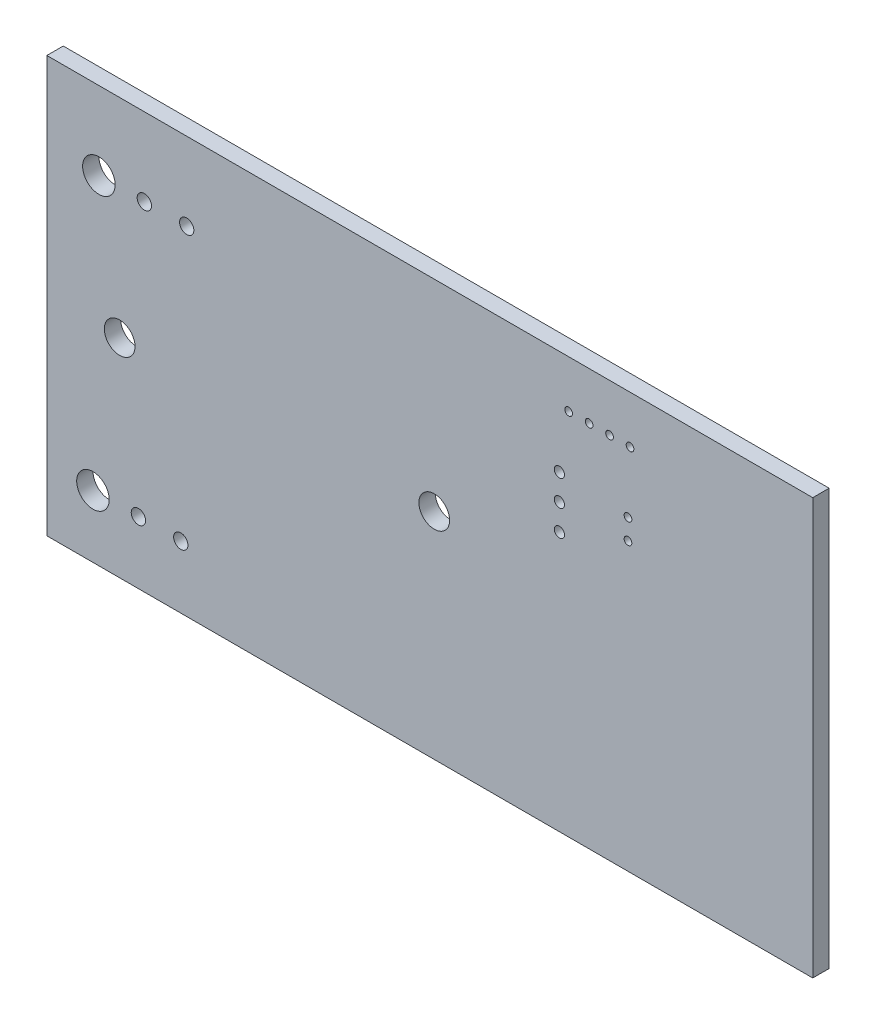
ISO-10303-21;
HEADER;
FILE_DESCRIPTION(('STEP AP214'),'2;1');
FILE_NAME('part.step','',(''),(''),'','','');
FILE_SCHEMA(('AUTOMOTIVE_DESIGN { 1 0 10303 214 1 1 1 1 }'));
ENDSEC;
DATA;
#1=APPLICATION_CONTEXT('core data for automotive mechanical design processes');
#2=APPLICATION_PROTOCOL_DEFINITION('international standard','automotive_design',2000,#1);
#3=PRODUCT_CONTEXT('',#1,'mechanical');
#4=PRODUCT('Part','Part','',(#3));
#5=PRODUCT_RELATED_PRODUCT_CATEGORY('part','',(#4));
#6=PRODUCT_DEFINITION_FORMATION('','',#4);
#7=PRODUCT_DEFINITION_CONTEXT('part definition',#1,'design');
#8=PRODUCT_DEFINITION('design','',#6,#7);
#9=PRODUCT_DEFINITION_SHAPE('','',#8);
#10=(LENGTH_UNIT() NAMED_UNIT(*) SI_UNIT(.MILLI.,.METRE.));
#11=(NAMED_UNIT(*) PLANE_ANGLE_UNIT() SI_UNIT($,.RADIAN.));
#12=(NAMED_UNIT(*) SI_UNIT($,.STERADIAN.) SOLID_ANGLE_UNIT());
#13=UNCERTAINTY_MEASURE_WITH_UNIT(LENGTH_MEASURE(1.E-05),#10,'distance_accuracy_value','');
#14=(GEOMETRIC_REPRESENTATION_CONTEXT(3) GLOBAL_UNCERTAINTY_ASSIGNED_CONTEXT((#13)) GLOBAL_UNIT_ASSIGNED_CONTEXT((#10,
#11,#12)) REPRESENTATION_CONTEXT('',''));
#15=CARTESIAN_POINT('',(0.,0.,0.));
#16=DIRECTION('',(0.,0.,1.));
#17=DIRECTION('',(1.,0.,0.));
#18=AXIS2_PLACEMENT_3D('',#15,#16,#17);
#19=CARTESIAN_POINT('',(144.09,-106.68,1.6));
#20=DIRECTION('',(0.,0.,1.));
#21=DIRECTION('',(1.,0.,0.));
#22=AXIS2_PLACEMENT_3D('',#19,#20,#21);
#23=PLANE('',#22);
#24=CARTESIAN_POINT('',(115.621,-120.904,1.6));
#25=DIRECTION('',(0.,0.,1.));
#26=DIRECTION('',(1.,0.,0.));
#27=AXIS2_PLACEMENT_3D('',#24,#25,#26);
#28=CIRCLE('',#27,0.7);
#29=CARTESIAN_POINT('',(116.321,-120.904,1.6));
#30=VERTEX_POINT('',#29);
#31=EDGE_CURVE('E19',#30,#30,#28,.F.);
#32=ORIENTED_EDGE('',*,*,#31,.T.);
#33=EDGE_LOOP('',(#32));
#34=FACE_BOUND('',#33,.T.);
#35=CARTESIAN_POINT('',(111.181,-120.904,1.6));
#36=DIRECTION('',(0.,0.,1.));
#37=DIRECTION('',(1.,0.,0.));
#38=AXIS2_PLACEMENT_3D('',#35,#36,#37);
#39=CIRCLE('',#38,1.59);
#40=CARTESIAN_POINT('',(112.771,-120.904,1.6));
#41=VERTEX_POINT('',#40);
#42=EDGE_CURVE('E127',#41,#41,#39,.F.);
#43=ORIENTED_EDGE('',*,*,#42,.T.);
#44=EDGE_LOOP('',(#43));
#45=FACE_BOUND('',#44,.T.);
#46=CARTESIAN_POINT('',(113.792,-106.68,1.6));
#47=DIRECTION('',(0.,0.,1.));
#48=DIRECTION('',(1.,0.,0.));
#49=AXIS2_PLACEMENT_3D('',#46,#47,#48);
#50=CIRCLE('',#49,1.5);
#51=CARTESIAN_POINT('',(115.292,-106.68,1.6));
#52=VERTEX_POINT('',#51);
#53=EDGE_CURVE('E166',#52,#52,#50,.F.);
#54=ORIENTED_EDGE('',*,*,#53,.T.);
#55=EDGE_LOOP('',(#54));
#56=FACE_BOUND('',#55,.T.);
#57=CARTESIAN_POINT('',(116.2,-93.98,1.6));
#58=DIRECTION('',(0.,0.,1.));
#59=DIRECTION('',(1.,0.,0.));
#60=AXIS2_PLACEMENT_3D('',#57,#58,#59);
#61=CIRCLE('',#60,0.7);
#62=CARTESIAN_POINT('',(116.9,-93.98,1.6));
#63=VERTEX_POINT('',#62);
#64=EDGE_CURVE('E171',#63,#63,#61,.F.);
#65=ORIENTED_EDGE('',*,*,#64,.T.);
#66=EDGE_LOOP('',(#65));
#67=FACE_BOUND('',#66,.T.);
#68=CARTESIAN_POINT('',(111.76,-93.98,1.6));
#69=DIRECTION('',(0.,0.,1.));
#70=DIRECTION('',(1.,0.,0.));
#71=AXIS2_PLACEMENT_3D('',#68,#69,#70);
#72=CIRCLE('',#71,1.59);
#73=CARTESIAN_POINT('',(113.35,-93.98,1.6));
#74=VERTEX_POINT('',#73);
#75=EDGE_CURVE('E169',#74,#74,#72,.F.);
#76=ORIENTED_EDGE('',*,*,#75,.T.);
#77=EDGE_LOOP('',(#76));
#78=FACE_BOUND('',#77,.T.);
#79=CARTESIAN_POINT('',(120.34,-93.98,1.6));
#80=DIRECTION('',(0.,0.,1.));
#81=DIRECTION('',(1.,0.,0.));
#82=AXIS2_PLACEMENT_3D('',#79,#80,#81);
#83=CIRCLE('',#82,0.7);
#84=CARTESIAN_POINT('',(121.04,-93.98,1.6));
#85=VERTEX_POINT('',#84);
#86=EDGE_CURVE('E163',#85,#85,#83,.F.);
#87=ORIENTED_EDGE('',*,*,#86,.T.);
#88=EDGE_LOOP('',(#87));
#89=FACE_BOUND('',#88,.T.);
#90=CARTESIAN_POINT('',(119.761,-120.904,1.6));
#91=DIRECTION('',(0.,0.,1.));
#92=DIRECTION('',(1.,0.,0.));
#93=AXIS2_PLACEMENT_3D('',#90,#91,#92);
#94=CIRCLE('',#93,0.7);
#95=CARTESIAN_POINT('',(120.461,-120.904,1.6));
#96=VERTEX_POINT('',#95);
#97=EDGE_CURVE('E160',#96,#96,#94,.F.);
#98=ORIENTED_EDGE('',*,*,#97,.T.);
#99=EDGE_LOOP('',(#98));
#100=FACE_BOUND('',#99,.T.);
#101=CARTESIAN_POINT('',(144.526,-106.0196,1.6));
#102=DIRECTION('',(0.,0.,1.));
#103=DIRECTION('',(1.,0.,0.));
#104=AXIS2_PLACEMENT_3D('',#101,#102,#103);
#105=CIRCLE('',#104,1.5);
#106=CARTESIAN_POINT('',(146.026,-106.0196,1.6));
#107=VERTEX_POINT('',#106);
#108=EDGE_CURVE('E145',#107,#107,#105,.F.);
#109=ORIENTED_EDGE('',*,*,#108,.T.);
#110=EDGE_LOOP('',(#109));
#111=FACE_BOUND('',#110,.T.);
#112=CARTESIAN_POINT('',(156.75,-101.65,1.6));
#113=DIRECTION('',(0.,0.,1.));
#114=DIRECTION('',(1.,0.,0.));
#115=AXIS2_PLACEMENT_3D('',#112,#113,#114);
#116=CIRCLE('',#115,0.5);
#117=CARTESIAN_POINT('',(157.25,-101.65,1.6));
#118=VERTEX_POINT('',#117);
#119=EDGE_CURVE('E154',#118,#118,#116,.F.);
#120=ORIENTED_EDGE('',*,*,#119,.T.);
#121=EDGE_LOOP('',(#120));
#122=FACE_BOUND('',#121,.T.);
#123=CARTESIAN_POINT('',(159.65,-91.,1.6));
#124=DIRECTION('',(0.,0.,1.));
#125=DIRECTION('',(1.,0.,0.));
#126=AXIS2_PLACEMENT_3D('',#123,#124,#125);
#127=CIRCLE('',#126,0.375);
#128=CARTESIAN_POINT('',(160.025,-91.,1.6));
#129=VERTEX_POINT('',#128);
#130=EDGE_CURVE('E139',#129,#129,#127,.F.);
#131=ORIENTED_EDGE('',*,*,#130,.T.);
#132=EDGE_LOOP('',(#131));
#133=FACE_BOUND('',#132,.T.);
#134=CARTESIAN_POINT('',(157.65,-91.,1.6));
#135=DIRECTION('',(0.,0.,1.));
#136=DIRECTION('',(1.,0.,0.));
#137=AXIS2_PLACEMENT_3D('',#134,#135,#136);
#138=CIRCLE('',#137,0.375);
#139=CARTESIAN_POINT('',(158.025,-91.,1.6));
#140=VERTEX_POINT('',#139);
#141=EDGE_CURVE('E157',#140,#140,#138,.F.);
#142=ORIENTED_EDGE('',*,*,#141,.T.);
#143=EDGE_LOOP('',(#142));
#144=FACE_BOUND('',#143,.T.);
#145=CARTESIAN_POINT('',(156.75,-96.57,1.6));
#146=DIRECTION('',(0.,0.,1.));
#147=DIRECTION('',(1.,0.,0.));
#148=AXIS2_PLACEMENT_3D('',#145,#146,#147);
#149=CIRCLE('',#148,0.5);
#150=CARTESIAN_POINT('',(157.25,-96.57,1.6));
#151=VERTEX_POINT('',#150);
#152=EDGE_CURVE('E151',#151,#151,#149,.F.);
#153=ORIENTED_EDGE('',*,*,#152,.T.);
#154=EDGE_LOOP('',(#153));
#155=FACE_BOUND('',#154,.T.);
#156=CARTESIAN_POINT('',(156.75,-99.11,1.6));
#157=DIRECTION('',(0.,0.,1.));
#158=DIRECTION('',(1.,0.,0.));
#159=AXIS2_PLACEMENT_3D('',#156,#157,#158);
#160=CIRCLE('',#159,0.5);
#161=CARTESIAN_POINT('',(157.25,-99.11,1.6));
#162=VERTEX_POINT('',#161);
#163=EDGE_CURVE('E148',#162,#162,#160,.F.);
#164=ORIENTED_EDGE('',*,*,#163,.T.);
#165=EDGE_LOOP('',(#164));
#166=FACE_BOUND('',#165,.T.);
#167=CARTESIAN_POINT('',(163.65,-91.,1.6));
#168=DIRECTION('',(0.,0.,1.));
#169=DIRECTION('',(1.,0.,0.));
#170=AXIS2_PLACEMENT_3D('',#167,#168,#169);
#171=CIRCLE('',#170,0.375);
#172=CARTESIAN_POINT('',(164.025,-91.,1.6));
#173=VERTEX_POINT('',#172);
#174=EDGE_CURVE('E133',#173,#173,#171,.F.);
#175=ORIENTED_EDGE('',*,*,#174,.T.);
#176=EDGE_LOOP('',(#175));
#177=FACE_BOUND('',#176,.T.);
#178=CARTESIAN_POINT('',(161.65,-91.,1.6));
#179=DIRECTION('',(0.,0.,1.));
#180=DIRECTION('',(1.,0.,0.));
#181=AXIS2_PLACEMENT_3D('',#178,#179,#180);
#182=CIRCLE('',#181,0.375);
#183=CARTESIAN_POINT('',(162.025,-91.,1.6));
#184=VERTEX_POINT('',#183);
#185=EDGE_CURVE('E136',#184,#184,#182,.F.);
#186=ORIENTED_EDGE('',*,*,#185,.T.);
#187=EDGE_LOOP('',(#186));
#188=FACE_BOUND('',#187,.T.);
#189=CARTESIAN_POINT('',(163.45,-97.05,1.6));
#190=DIRECTION('',(0.,0.,1.));
#191=DIRECTION('',(1.,0.,0.));
#192=AXIS2_PLACEMENT_3D('',#189,#190,#191);
#193=CIRCLE('',#192,0.375);
#194=CARTESIAN_POINT('',(163.825,-97.05,1.6));
#195=VERTEX_POINT('',#194);
#196=EDGE_CURVE('E142',#195,#195,#193,.F.);
#197=ORIENTED_EDGE('',*,*,#196,.T.);
#198=EDGE_LOOP('',(#197));
#199=FACE_BOUND('',#198,.T.);
#200=CARTESIAN_POINT('',(163.45,-99.05,1.6));
#201=DIRECTION('',(0.,0.,1.));
#202=DIRECTION('',(1.,0.,0.));
#203=AXIS2_PLACEMENT_3D('',#200,#201,#202);
#204=CIRCLE('',#203,0.375);
#205=CARTESIAN_POINT('',(163.825,-99.05,1.6));
#206=VERTEX_POINT('',#205);
#207=EDGE_CURVE('E130',#206,#206,#204,.F.);
#208=ORIENTED_EDGE('',*,*,#207,.T.);
#209=EDGE_LOOP('',(#208));
#210=FACE_BOUND('',#209,.T.);
#211=DIRECTION('',(1.,0.,0.));
#212=VECTOR('',#211,1.);
#213=CARTESIAN_POINT('',(181.5,-86.36,1.6));
#214=LINE('',#213,#212);
#215=CARTESIAN_POINT('',(181.5,-86.36,1.6));
#216=VERTEX_POINT('',#215);
#217=CARTESIAN_POINT('',(106.68,-86.36,1.6));
#218=VERTEX_POINT('',#217);
#219=EDGE_CURVE('E185',#216,#218,#214,.F.);
#220=ORIENTED_EDGE('',*,*,#219,.T.);
#221=DIRECTION('',(0.,1.,0.));
#222=VECTOR('',#221,1.);
#223=CARTESIAN_POINT('',(106.68,-86.36,1.6));
#224=LINE('',#223,#222);
#225=CARTESIAN_POINT('',(106.68,-127.,1.6));
#226=VERTEX_POINT('',#225);
#227=EDGE_CURVE('E59',#218,#226,#224,.F.);
#228=ORIENTED_EDGE('',*,*,#227,.T.);
#229=DIRECTION('',(1.,0.,0.));
#230=VECTOR('',#229,1.);
#231=CARTESIAN_POINT('',(106.68,-127.,1.6));
#232=LINE('',#231,#230);
#233=CARTESIAN_POINT('',(181.5,-127.,1.6));
#234=VERTEX_POINT('',#233);
#235=EDGE_CURVE('E58',#226,#234,#232,.T.);
#236=ORIENTED_EDGE('',*,*,#235,.T.);
#237=DIRECTION('',(0.,1.,0.));
#238=VECTOR('',#237,1.);
#239=CARTESIAN_POINT('',(181.5,-127.,1.6));
#240=LINE('',#239,#238);
#241=EDGE_CURVE('E55',#234,#216,#240,.T.);
#242=ORIENTED_EDGE('',*,*,#241,.T.);
#243=EDGE_LOOP('',(#220,#228,#236,#242));
#244=FACE_BOUND('',#243,.T.);
#245=ADVANCED_FACE('F16',(#34,#45,#56,#67,#78,#89,#100,#111,#122,#133,#144,#155,#166,#177,#188,
#199,#210,#244),#23,.T.);
#246=CARTESIAN_POINT('',(106.68,-127.,0.));
#247=DIRECTION('',(0.,1.,0.));
#248=DIRECTION('',(0.,0.,1.));
#249=AXIS2_PLACEMENT_3D('',#246,#247,#248);
#250=PLANE('',#249);
#251=DIRECTION('',(0.,0.,1.));
#252=VECTOR('',#251,1.);
#253=CARTESIAN_POINT('',(181.5,-127.,0.));
#254=LINE('',#253,#252);
#255=CARTESIAN_POINT('',(181.5,-127.,0.));
#256=VERTEX_POINT('',#255);
#257=EDGE_CURVE('E64',#256,#234,#254,.T.);
#258=ORIENTED_EDGE('',*,*,#257,.T.);
#259=ORIENTED_EDGE('',*,*,#235,.F.);
#260=DIRECTION('',(0.,0.,-1.));
#261=VECTOR('',#260,1.);
#262=CARTESIAN_POINT('',(106.68,-127.,0.));
#263=LINE('',#262,#261);
#264=CARTESIAN_POINT('',(106.68,-127.,0.));
#265=VERTEX_POINT('',#264);
#266=EDGE_CURVE('E176',#226,#265,#263,.T.);
#267=ORIENTED_EDGE('',*,*,#266,.T.);
#268=DIRECTION('',(1.,0.,0.));
#269=VECTOR('',#268,1.);
#270=CARTESIAN_POINT('',(144.09,-127.,0.));
#271=LINE('',#270,#269);
#272=EDGE_CURVE('E75',#265,#256,#271,.T.);
#273=ORIENTED_EDGE('',*,*,#272,.T.);
#274=EDGE_LOOP('',(#258,#259,#267,#273));
#275=FACE_BOUND('',#274,.T.);
#276=ADVANCED_FACE('F74',(#275),#250,.F.);
#277=CARTESIAN_POINT('',(181.5,-127.,0.));
#278=DIRECTION('',(-1.,0.,0.));
#279=DIRECTION('',(0.,0.,1.));
#280=AXIS2_PLACEMENT_3D('',#277,#278,#279);
#281=PLANE('',#280);
#282=DIRECTION('',(0.,0.,-1.));
#283=VECTOR('',#282,1.);
#284=CARTESIAN_POINT('',(181.5,-86.36,0.));
#285=LINE('',#284,#283);
#286=CARTESIAN_POINT('',(181.5,-86.36,0.));
#287=VERTEX_POINT('',#286);
#288=EDGE_CURVE('E71',#287,#216,#285,.F.);
#289=ORIENTED_EDGE('',*,*,#288,.T.);
#290=ORIENTED_EDGE('',*,*,#241,.F.);
#291=ORIENTED_EDGE('',*,*,#257,.F.);
#292=DIRECTION('',(0.,1.,0.));
#293=VECTOR('',#292,1.);
#294=CARTESIAN_POINT('',(181.5,-106.68,0.));
#295=LINE('',#294,#293);
#296=EDGE_CURVE('E193',#256,#287,#295,.T.);
#297=ORIENTED_EDGE('',*,*,#296,.T.);
#298=EDGE_LOOP('',(#289,#290,#291,#297));
#299=FACE_BOUND('',#298,.T.);
#300=ADVANCED_FACE('F68',(#299),#281,.F.);
#301=CARTESIAN_POINT('',(181.5,-86.36,0.));
#302=DIRECTION('',(0.,-1.,0.));
#303=DIRECTION('',(0.,0.,-1.));
#304=AXIS2_PLACEMENT_3D('',#301,#302,#303);
#305=PLANE('',#304);
#306=DIRECTION('',(0.,0.,-1.));
#307=VECTOR('',#306,1.);
#308=CARTESIAN_POINT('',(106.68,-86.36,0.));
#309=LINE('',#308,#307);
#310=CARTESIAN_POINT('',(106.68,-86.36,0.));
#311=VERTEX_POINT('',#310);
#312=EDGE_CURVE('E34',#311,#218,#309,.F.);
#313=ORIENTED_EDGE('',*,*,#312,.T.);
#314=ORIENTED_EDGE('',*,*,#219,.F.);
#315=ORIENTED_EDGE('',*,*,#288,.F.);
#316=DIRECTION('',(1.,0.,0.));
#317=VECTOR('',#316,1.);
#318=CARTESIAN_POINT('',(144.09,-86.36,0.));
#319=LINE('',#318,#317);
#320=EDGE_CURVE('E191',#287,#311,#319,.F.);
#321=ORIENTED_EDGE('',*,*,#320,.T.);
#322=EDGE_LOOP('',(#313,#314,#315,#321));
#323=FACE_BOUND('',#322,.T.);
#324=ADVANCED_FACE('F189',(#323),#305,.F.);
#325=CARTESIAN_POINT('',(106.68,-86.36,0.));
#326=DIRECTION('',(1.,0.,0.));
#327=DIRECTION('',(0.,0.,-1.));
#328=AXIS2_PLACEMENT_3D('',#325,#326,#327);
#329=PLANE('',#328);
#330=ORIENTED_EDGE('',*,*,#266,.F.);
#331=ORIENTED_EDGE('',*,*,#227,.F.);
#332=ORIENTED_EDGE('',*,*,#312,.F.);
#333=DIRECTION('',(0.,1.,0.));
#334=VECTOR('',#333,1.);
#335=CARTESIAN_POINT('',(106.68,-106.68,0.));
#336=LINE('',#335,#334);
#337=EDGE_CURVE('E126',#311,#265,#336,.F.);
#338=ORIENTED_EDGE('',*,*,#337,.T.);
#339=EDGE_LOOP('',(#330,#331,#332,#338));
#340=FACE_BOUND('',#339,.T.);
#341=ADVANCED_FACE('F187',(#340),#329,.F.);
#342=CARTESIAN_POINT('',(115.621,-120.904,-0.8));
#343=DIRECTION('',(0.,0.,1.));
#344=DIRECTION('',(1.,0.,0.));
#345=AXIS2_PLACEMENT_3D('',#342,#343,#344);
#346=CYLINDRICAL_SURFACE('',#345,0.7);
#347=CARTESIAN_POINT('',(115.621,-120.904,0.));
#348=DIRECTION('',(0.,0.,1.));
#349=DIRECTION('',(1.,0.,0.));
#350=AXIS2_PLACEMENT_3D('',#347,#348,#349);
#351=CIRCLE('',#350,0.7);
#352=CARTESIAN_POINT('',(116.321,-120.904,0.));
#353=VERTEX_POINT('',#352);
#354=EDGE_CURVE('E123',#353,#353,#351,.F.);
#355=ORIENTED_EDGE('',*,*,#354,.T.);
#356=EDGE_LOOP('',(#355));
#357=FACE_BOUND('',#356,.T.);
#358=ORIENTED_EDGE('',*,*,#31,.F.);
#359=EDGE_LOOP('',(#358));
#360=FACE_BOUND('',#359,.T.);
#361=ADVANCED_FACE('F269',(#357,#360),#346,.F.);
#362=CARTESIAN_POINT('',(116.2,-93.98,-0.8));
#363=DIRECTION('',(0.,0.,1.));
#364=DIRECTION('',(1.,0.,0.));
#365=AXIS2_PLACEMENT_3D('',#362,#363,#364);
#366=CYLINDRICAL_SURFACE('',#365,0.7);
#367=CARTESIAN_POINT('',(116.2,-93.98,0.));
#368=DIRECTION('',(0.,0.,1.));
#369=DIRECTION('',(1.,0.,0.));
#370=AXIS2_PLACEMENT_3D('',#367,#368,#369);
#371=CIRCLE('',#370,0.7);
#372=CARTESIAN_POINT('',(116.9,-93.98,0.));
#373=VERTEX_POINT('',#372);
#374=EDGE_CURVE('E120',#373,#373,#371,.F.);
#375=ORIENTED_EDGE('',*,*,#374,.T.);
#376=EDGE_LOOP('',(#375));
#377=FACE_BOUND('',#376,.T.);
#378=ORIENTED_EDGE('',*,*,#64,.F.);
#379=EDGE_LOOP('',(#378));
#380=FACE_BOUND('',#379,.T.);
#381=ADVANCED_FACE('F265',(#377,#380),#366,.F.);
#382=CARTESIAN_POINT('',(111.76,-93.98,-0.8));
#383=DIRECTION('',(0.,0.,1.));
#384=DIRECTION('',(1.,0.,0.));
#385=AXIS2_PLACEMENT_3D('',#382,#383,#384);
#386=CYLINDRICAL_SURFACE('',#385,1.59);
#387=CARTESIAN_POINT('',(111.76,-93.98,0.));
#388=DIRECTION('',(0.,0.,1.));
#389=DIRECTION('',(1.,0.,0.));
#390=AXIS2_PLACEMENT_3D('',#387,#388,#389);
#391=CIRCLE('',#390,1.59);
#392=CARTESIAN_POINT('',(113.35,-93.98,0.));
#393=VERTEX_POINT('',#392);
#394=EDGE_CURVE('E117',#393,#393,#391,.F.);
#395=ORIENTED_EDGE('',*,*,#394,.T.);
#396=EDGE_LOOP('',(#395));
#397=FACE_BOUND('',#396,.T.);
#398=ORIENTED_EDGE('',*,*,#75,.F.);
#399=EDGE_LOOP('',(#398));
#400=FACE_BOUND('',#399,.T.);
#401=ADVANCED_FACE('F261',(#397,#400),#386,.F.);
#402=CARTESIAN_POINT('',(113.792,-106.68,-0.8));
#403=DIRECTION('',(0.,0.,1.));
#404=DIRECTION('',(1.,0.,0.));
#405=AXIS2_PLACEMENT_3D('',#402,#403,#404);
#406=CYLINDRICAL_SURFACE('',#405,1.5);
#407=CARTESIAN_POINT('',(113.792,-106.68,0.));
#408=DIRECTION('',(0.,0.,1.));
#409=DIRECTION('',(1.,0.,0.));
#410=AXIS2_PLACEMENT_3D('',#407,#408,#409);
#411=CIRCLE('',#410,1.5);
#412=CARTESIAN_POINT('',(115.292,-106.68,0.));
#413=VERTEX_POINT('',#412);
#414=EDGE_CURVE('E114',#413,#413,#411,.F.);
#415=ORIENTED_EDGE('',*,*,#414,.T.);
#416=EDGE_LOOP('',(#415));
#417=FACE_BOUND('',#416,.T.);
#418=ORIENTED_EDGE('',*,*,#53,.F.);
#419=EDGE_LOOP('',(#418));
#420=FACE_BOUND('',#419,.T.);
#421=ADVANCED_FACE('F257',(#417,#420),#406,.F.);
#422=CARTESIAN_POINT('',(120.34,-93.98,-0.8));
#423=DIRECTION('',(0.,0.,1.));
#424=DIRECTION('',(1.,0.,0.));
#425=AXIS2_PLACEMENT_3D('',#422,#423,#424);
#426=CYLINDRICAL_SURFACE('',#425,0.7);
#427=CARTESIAN_POINT('',(120.34,-93.98,0.));
#428=DIRECTION('',(0.,0.,1.));
#429=DIRECTION('',(1.,0.,0.));
#430=AXIS2_PLACEMENT_3D('',#427,#428,#429);
#431=CIRCLE('',#430,0.7);
#432=CARTESIAN_POINT('',(121.04,-93.98,0.));
#433=VERTEX_POINT('',#432);
#434=EDGE_CURVE('E111',#433,#433,#431,.F.);
#435=ORIENTED_EDGE('',*,*,#434,.T.);
#436=EDGE_LOOP('',(#435));
#437=FACE_BOUND('',#436,.T.);
#438=ORIENTED_EDGE('',*,*,#86,.F.);
#439=EDGE_LOOP('',(#438));
#440=FACE_BOUND('',#439,.T.);
#441=ADVANCED_FACE('F253',(#437,#440),#426,.F.);
#442=CARTESIAN_POINT('',(119.761,-120.904,-0.8));
#443=DIRECTION('',(0.,0.,1.));
#444=DIRECTION('',(1.,0.,0.));
#445=AXIS2_PLACEMENT_3D('',#442,#443,#444);
#446=CYLINDRICAL_SURFACE('',#445,0.7);
#447=CARTESIAN_POINT('',(119.761,-120.904,0.));
#448=DIRECTION('',(0.,0.,1.));
#449=DIRECTION('',(1.,0.,0.));
#450=AXIS2_PLACEMENT_3D('',#447,#448,#449);
#451=CIRCLE('',#450,0.7);
#452=CARTESIAN_POINT('',(120.461,-120.904,0.));
#453=VERTEX_POINT('',#452);
#454=EDGE_CURVE('E108',#453,#453,#451,.F.);
#455=ORIENTED_EDGE('',*,*,#454,.T.);
#456=EDGE_LOOP('',(#455));
#457=FACE_BOUND('',#456,.T.);
#458=ORIENTED_EDGE('',*,*,#97,.F.);
#459=EDGE_LOOP('',(#458));
#460=FACE_BOUND('',#459,.T.);
#461=ADVANCED_FACE('F249',(#457,#460),#446,.F.);
#462=CARTESIAN_POINT('',(157.65,-91.,-0.8));
#463=DIRECTION('',(0.,0.,1.));
#464=DIRECTION('',(1.,0.,0.));
#465=AXIS2_PLACEMENT_3D('',#462,#463,#464);
#466=CYLINDRICAL_SURFACE('',#465,0.375);
#467=CARTESIAN_POINT('',(157.65,-91.,0.));
#468=DIRECTION('',(0.,0.,1.));
#469=DIRECTION('',(1.,0.,0.));
#470=AXIS2_PLACEMENT_3D('',#467,#468,#469);
#471=CIRCLE('',#470,0.375);
#472=CARTESIAN_POINT('',(158.025,-91.,0.));
#473=VERTEX_POINT('',#472);
#474=EDGE_CURVE('E105',#473,#473,#471,.F.);
#475=ORIENTED_EDGE('',*,*,#474,.T.);
#476=EDGE_LOOP('',(#475));
#477=FACE_BOUND('',#476,.T.);
#478=ORIENTED_EDGE('',*,*,#141,.F.);
#479=EDGE_LOOP('',(#478));
#480=FACE_BOUND('',#479,.T.);
#481=ADVANCED_FACE('F245',(#477,#480),#466,.F.);
#482=CARTESIAN_POINT('',(156.75,-101.65,-0.8));
#483=DIRECTION('',(0.,0.,1.));
#484=DIRECTION('',(1.,0.,0.));
#485=AXIS2_PLACEMENT_3D('',#482,#483,#484);
#486=CYLINDRICAL_SURFACE('',#485,0.5);
#487=CARTESIAN_POINT('',(156.75,-101.65,0.));
#488=DIRECTION('',(0.,0.,1.));
#489=DIRECTION('',(1.,0.,0.));
#490=AXIS2_PLACEMENT_3D('',#487,#488,#489);
#491=CIRCLE('',#490,0.5);
#492=CARTESIAN_POINT('',(157.25,-101.65,0.));
#493=VERTEX_POINT('',#492);
#494=EDGE_CURVE('E102',#493,#493,#491,.F.);
#495=ORIENTED_EDGE('',*,*,#494,.T.);
#496=EDGE_LOOP('',(#495));
#497=FACE_BOUND('',#496,.T.);
#498=ORIENTED_EDGE('',*,*,#119,.F.);
#499=EDGE_LOOP('',(#498));
#500=FACE_BOUND('',#499,.T.);
#501=ADVANCED_FACE('F241',(#497,#500),#486,.F.);
#502=CARTESIAN_POINT('',(156.75,-96.57,-0.8));
#503=DIRECTION('',(0.,0.,1.));
#504=DIRECTION('',(1.,0.,0.));
#505=AXIS2_PLACEMENT_3D('',#502,#503,#504);
#506=CYLINDRICAL_SURFACE('',#505,0.5);
#507=CARTESIAN_POINT('',(156.75,-96.57,0.));
#508=DIRECTION('',(0.,0.,1.));
#509=DIRECTION('',(1.,0.,0.));
#510=AXIS2_PLACEMENT_3D('',#507,#508,#509);
#511=CIRCLE('',#510,0.5);
#512=CARTESIAN_POINT('',(157.25,-96.57,0.));
#513=VERTEX_POINT('',#512);
#514=EDGE_CURVE('E99',#513,#513,#511,.F.);
#515=ORIENTED_EDGE('',*,*,#514,.T.);
#516=EDGE_LOOP('',(#515));
#517=FACE_BOUND('',#516,.T.);
#518=ORIENTED_EDGE('',*,*,#152,.F.);
#519=EDGE_LOOP('',(#518));
#520=FACE_BOUND('',#519,.T.);
#521=ADVANCED_FACE('F237',(#517,#520),#506,.F.);
#522=CARTESIAN_POINT('',(156.75,-99.11,-0.8));
#523=DIRECTION('',(0.,0.,1.));
#524=DIRECTION('',(1.,0.,0.));
#525=AXIS2_PLACEMENT_3D('',#522,#523,#524);
#526=CYLINDRICAL_SURFACE('',#525,0.5);
#527=CARTESIAN_POINT('',(156.75,-99.11,0.));
#528=DIRECTION('',(0.,0.,1.));
#529=DIRECTION('',(1.,0.,0.));
#530=AXIS2_PLACEMENT_3D('',#527,#528,#529);
#531=CIRCLE('',#530,0.5);
#532=CARTESIAN_POINT('',(157.25,-99.11,0.));
#533=VERTEX_POINT('',#532);
#534=EDGE_CURVE('E96',#533,#533,#531,.F.);
#535=ORIENTED_EDGE('',*,*,#534,.T.);
#536=EDGE_LOOP('',(#535));
#537=FACE_BOUND('',#536,.T.);
#538=ORIENTED_EDGE('',*,*,#163,.F.);
#539=EDGE_LOOP('',(#538));
#540=FACE_BOUND('',#539,.T.);
#541=ADVANCED_FACE('F233',(#537,#540),#526,.F.);
#542=CARTESIAN_POINT('',(144.526,-106.0196,-0.8));
#543=DIRECTION('',(0.,0.,1.));
#544=DIRECTION('',(1.,0.,0.));
#545=AXIS2_PLACEMENT_3D('',#542,#543,#544);
#546=CYLINDRICAL_SURFACE('',#545,1.5);
#547=CARTESIAN_POINT('',(144.526,-106.0196,0.));
#548=DIRECTION('',(0.,0.,1.));
#549=DIRECTION('',(1.,0.,0.));
#550=AXIS2_PLACEMENT_3D('',#547,#548,#549);
#551=CIRCLE('',#550,1.5);
#552=CARTESIAN_POINT('',(146.026,-106.0196,0.));
#553=VERTEX_POINT('',#552);
#554=EDGE_CURVE('E93',#553,#553,#551,.F.);
#555=ORIENTED_EDGE('',*,*,#554,.T.);
#556=EDGE_LOOP('',(#555));
#557=FACE_BOUND('',#556,.T.);
#558=ORIENTED_EDGE('',*,*,#108,.F.);
#559=EDGE_LOOP('',(#558));
#560=FACE_BOUND('',#559,.T.);
#561=ADVANCED_FACE('F229',(#557,#560),#546,.F.);
#562=CARTESIAN_POINT('',(163.45,-97.05,-0.8));
#563=DIRECTION('',(0.,0.,1.));
#564=DIRECTION('',(1.,0.,0.));
#565=AXIS2_PLACEMENT_3D('',#562,#563,#564);
#566=CYLINDRICAL_SURFACE('',#565,0.375);
#567=CARTESIAN_POINT('',(163.45,-97.05,0.));
#568=DIRECTION('',(0.,0.,1.));
#569=DIRECTION('',(1.,0.,0.));
#570=AXIS2_PLACEMENT_3D('',#567,#568,#569);
#571=CIRCLE('',#570,0.375);
#572=CARTESIAN_POINT('',(163.825,-97.05,0.));
#573=VERTEX_POINT('',#572);
#574=EDGE_CURVE('E90',#573,#573,#571,.F.);
#575=ORIENTED_EDGE('',*,*,#574,.T.);
#576=EDGE_LOOP('',(#575));
#577=FACE_BOUND('',#576,.T.);
#578=ORIENTED_EDGE('',*,*,#196,.F.);
#579=EDGE_LOOP('',(#578));
#580=FACE_BOUND('',#579,.T.);
#581=ADVANCED_FACE('F225',(#577,#580),#566,.F.);
#582=CARTESIAN_POINT('',(159.65,-91.,-0.8));
#583=DIRECTION('',(0.,0.,1.));
#584=DIRECTION('',(1.,0.,0.));
#585=AXIS2_PLACEMENT_3D('',#582,#583,#584);
#586=CYLINDRICAL_SURFACE('',#585,0.375);
#587=CARTESIAN_POINT('',(159.65,-91.,0.));
#588=DIRECTION('',(0.,0.,1.));
#589=DIRECTION('',(1.,0.,0.));
#590=AXIS2_PLACEMENT_3D('',#587,#588,#589);
#591=CIRCLE('',#590,0.375);
#592=CARTESIAN_POINT('',(160.025,-91.,0.));
#593=VERTEX_POINT('',#592);
#594=EDGE_CURVE('E87',#593,#593,#591,.F.);
#595=ORIENTED_EDGE('',*,*,#594,.T.);
#596=EDGE_LOOP('',(#595));
#597=FACE_BOUND('',#596,.T.);
#598=ORIENTED_EDGE('',*,*,#130,.F.);
#599=EDGE_LOOP('',(#598));
#600=FACE_BOUND('',#599,.T.);
#601=ADVANCED_FACE('F221',(#597,#600),#586,.F.);
#602=CARTESIAN_POINT('',(161.65,-91.,-0.8));
#603=DIRECTION('',(0.,0.,1.));
#604=DIRECTION('',(1.,0.,0.));
#605=AXIS2_PLACEMENT_3D('',#602,#603,#604);
#606=CYLINDRICAL_SURFACE('',#605,0.375);
#607=CARTESIAN_POINT('',(161.65,-91.,0.));
#608=DIRECTION('',(0.,0.,1.));
#609=DIRECTION('',(1.,0.,0.));
#610=AXIS2_PLACEMENT_3D('',#607,#608,#609);
#611=CIRCLE('',#610,0.375);
#612=CARTESIAN_POINT('',(162.025,-91.,0.));
#613=VERTEX_POINT('',#612);
#614=EDGE_CURVE('E84',#613,#613,#611,.F.);
#615=ORIENTED_EDGE('',*,*,#614,.T.);
#616=EDGE_LOOP('',(#615));
#617=FACE_BOUND('',#616,.T.);
#618=ORIENTED_EDGE('',*,*,#185,.F.);
#619=EDGE_LOOP('',(#618));
#620=FACE_BOUND('',#619,.T.);
#621=ADVANCED_FACE('F217',(#617,#620),#606,.F.);
#622=CARTESIAN_POINT('',(163.65,-91.,-0.8));
#623=DIRECTION('',(0.,0.,1.));
#624=DIRECTION('',(1.,0.,0.));
#625=AXIS2_PLACEMENT_3D('',#622,#623,#624);
#626=CYLINDRICAL_SURFACE('',#625,0.375);
#627=CARTESIAN_POINT('',(163.65,-91.,0.));
#628=DIRECTION('',(0.,0.,1.));
#629=DIRECTION('',(1.,0.,0.));
#630=AXIS2_PLACEMENT_3D('',#627,#628,#629);
#631=CIRCLE('',#630,0.375);
#632=CARTESIAN_POINT('',(164.025,-91.,0.));
#633=VERTEX_POINT('',#632);
#634=EDGE_CURVE('E81',#633,#633,#631,.F.);
#635=ORIENTED_EDGE('',*,*,#634,.T.);
#636=EDGE_LOOP('',(#635));
#637=FACE_BOUND('',#636,.T.);
#638=ORIENTED_EDGE('',*,*,#174,.F.);
#639=EDGE_LOOP('',(#638));
#640=FACE_BOUND('',#639,.T.);
#641=ADVANCED_FACE('F213',(#637,#640),#626,.F.);
#642=CARTESIAN_POINT('',(163.45,-99.05,-0.8));
#643=DIRECTION('',(0.,0.,1.));
#644=DIRECTION('',(1.,0.,0.));
#645=AXIS2_PLACEMENT_3D('',#642,#643,#644);
#646=CYLINDRICAL_SURFACE('',#645,0.375);
#647=CARTESIAN_POINT('',(163.45,-99.05,0.));
#648=DIRECTION('',(0.,0.,1.));
#649=DIRECTION('',(1.,0.,0.));
#650=AXIS2_PLACEMENT_3D('',#647,#648,#649);
#651=CIRCLE('',#650,0.375);
#652=CARTESIAN_POINT('',(163.825,-99.05,0.));
#653=VERTEX_POINT('',#652);
#654=EDGE_CURVE('E25',#653,#653,#651,.F.);
#655=ORIENTED_EDGE('',*,*,#654,.T.);
#656=EDGE_LOOP('',(#655));
#657=FACE_BOUND('',#656,.T.);
#658=ORIENTED_EDGE('',*,*,#207,.F.);
#659=EDGE_LOOP('',(#658));
#660=FACE_BOUND('',#659,.T.);
#661=ADVANCED_FACE('F205',(#657,#660),#646,.F.);
#662=CARTESIAN_POINT('',(111.181,-120.904,-0.8));
#663=DIRECTION('',(0.,0.,1.));
#664=DIRECTION('',(1.,0.,0.));
#665=AXIS2_PLACEMENT_3D('',#662,#663,#664);
#666=CYLINDRICAL_SURFACE('',#665,1.59);
#667=CARTESIAN_POINT('',(111.181,-120.904,0.));
#668=DIRECTION('',(0.,0.,1.));
#669=DIRECTION('',(1.,0.,0.));
#670=AXIS2_PLACEMENT_3D('',#667,#668,#669);
#671=CIRCLE('',#670,1.59);
#672=CARTESIAN_POINT('',(112.771,-120.904,0.));
#673=VERTEX_POINT('',#672);
#674=EDGE_CURVE('E10',#673,#673,#671,.F.);
#675=ORIENTED_EDGE('',*,*,#674,.T.);
#676=EDGE_LOOP('',(#675));
#677=FACE_BOUND('',#676,.T.);
#678=ORIENTED_EDGE('',*,*,#42,.F.);
#679=EDGE_LOOP('',(#678));
#680=FACE_BOUND('',#679,.T.);
#681=ADVANCED_FACE('F198',(#677,#680),#666,.F.);
#682=CARTESIAN_POINT('',(144.09,-106.68,0.));
#683=DIRECTION('',(0.,0.,1.));
#684=DIRECTION('',(1.,0.,0.));
#685=AXIS2_PLACEMENT_3D('',#682,#683,#684);
#686=PLANE('',#685);
#687=ORIENTED_EDGE('',*,*,#674,.F.);
#688=EDGE_LOOP('',(#687));
#689=FACE_BOUND('',#688,.T.);
#690=ORIENTED_EDGE('',*,*,#654,.F.);
#691=EDGE_LOOP('',(#690));
#692=FACE_BOUND('',#691,.T.);
#693=ORIENTED_EDGE('',*,*,#634,.F.);
#694=EDGE_LOOP('',(#693));
#695=FACE_BOUND('',#694,.T.);
#696=ORIENTED_EDGE('',*,*,#614,.F.);
#697=EDGE_LOOP('',(#696));
#698=FACE_BOUND('',#697,.T.);
#699=ORIENTED_EDGE('',*,*,#594,.F.);
#700=EDGE_LOOP('',(#699));
#701=FACE_BOUND('',#700,.T.);
#702=ORIENTED_EDGE('',*,*,#574,.F.);
#703=EDGE_LOOP('',(#702));
#704=FACE_BOUND('',#703,.T.);
#705=ORIENTED_EDGE('',*,*,#554,.F.);
#706=EDGE_LOOP('',(#705));
#707=FACE_BOUND('',#706,.T.);
#708=ORIENTED_EDGE('',*,*,#534,.F.);
#709=EDGE_LOOP('',(#708));
#710=FACE_BOUND('',#709,.T.);
#711=ORIENTED_EDGE('',*,*,#514,.F.);
#712=EDGE_LOOP('',(#711));
#713=FACE_BOUND('',#712,.T.);
#714=ORIENTED_EDGE('',*,*,#494,.F.);
#715=EDGE_LOOP('',(#714));
#716=FACE_BOUND('',#715,.T.);
#717=ORIENTED_EDGE('',*,*,#474,.F.);
#718=EDGE_LOOP('',(#717));
#719=FACE_BOUND('',#718,.T.);
#720=ORIENTED_EDGE('',*,*,#454,.F.);
#721=EDGE_LOOP('',(#720));
#722=FACE_BOUND('',#721,.T.);
#723=ORIENTED_EDGE('',*,*,#434,.F.);
#724=EDGE_LOOP('',(#723));
#725=FACE_BOUND('',#724,.T.);
#726=ORIENTED_EDGE('',*,*,#414,.F.);
#727=EDGE_LOOP('',(#726));
#728=FACE_BOUND('',#727,.T.);
#729=ORIENTED_EDGE('',*,*,#394,.F.);
#730=EDGE_LOOP('',(#729));
#731=FACE_BOUND('',#730,.T.);
#732=ORIENTED_EDGE('',*,*,#374,.F.);
#733=EDGE_LOOP('',(#732));
#734=FACE_BOUND('',#733,.T.);
#735=ORIENTED_EDGE('',*,*,#354,.F.);
#736=EDGE_LOOP('',(#735));
#737=FACE_BOUND('',#736,.T.);
#738=ORIENTED_EDGE('',*,*,#320,.F.);
#739=ORIENTED_EDGE('',*,*,#296,.F.);
#740=ORIENTED_EDGE('',*,*,#272,.F.);
#741=ORIENTED_EDGE('',*,*,#337,.F.);
#742=EDGE_LOOP('',(#738,#739,#740,#741));
#743=FACE_BOUND('',#742,.T.);
#744=ADVANCED_FACE('F196',(#689,#692,#695,#698,#701,#704,#707,#710,#713,#716,#719,#722,#725,
#728,#731,#734,#737,#743),#686,.F.);
#745=CLOSED_SHELL('',(#245,#276,#300,#324,#341,#361,#381,#401,#421,#441,#461,#481,#501,#521,
#541,#561,#581,#601,#621,#641,#661,#681,#744));
#746=MANIFOLD_SOLID_BREP('B1',#745);
#747=ADVANCED_BREP_SHAPE_REPRESENTATION('',(#18,#746),#14);
#748=SHAPE_DEFINITION_REPRESENTATION(#9,#747);
ENDSEC;
END-ISO-10303-21;
